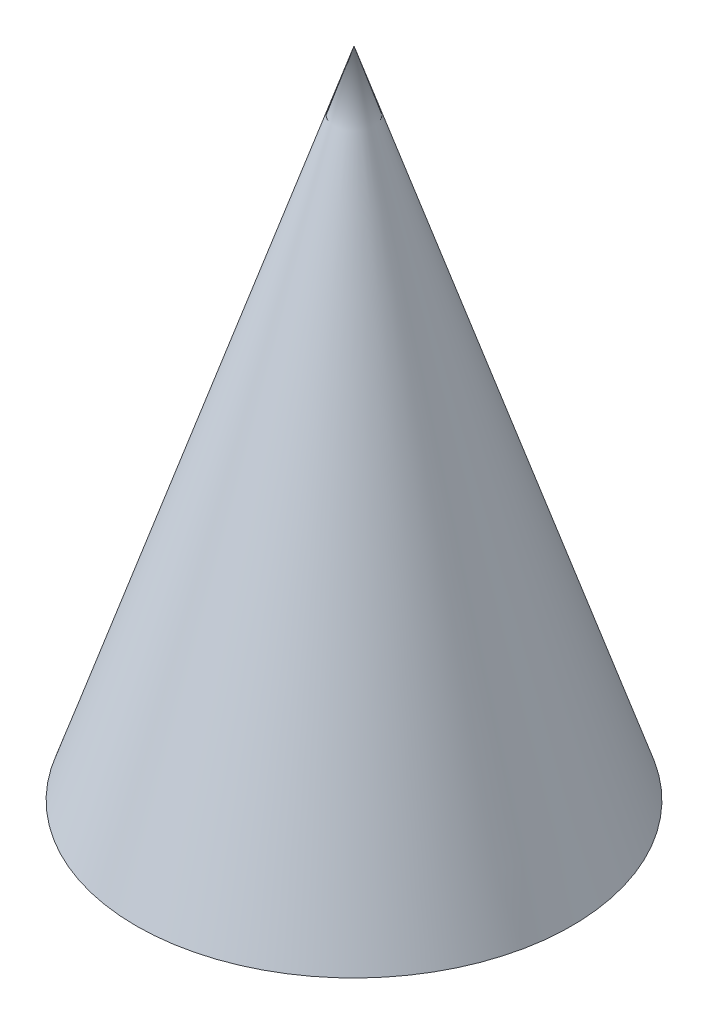
ISO-10303-21;
HEADER;
FILE_DESCRIPTION(('STEP AP214'),'2;1');
FILE_NAME('part.step','',(''),(''),'','','');
FILE_SCHEMA(('AUTOMOTIVE_DESIGN { 1 0 10303 214 1 1 1 1 }'));
ENDSEC;
DATA;
#1=APPLICATION_CONTEXT('core data for automotive mechanical design processes');
#2=APPLICATION_PROTOCOL_DEFINITION('international standard','automotive_design',2000,#1);
#3=PRODUCT_CONTEXT('',#1,'mechanical');
#4=PRODUCT('Part','Part','',(#3));
#5=PRODUCT_RELATED_PRODUCT_CATEGORY('part','',(#4));
#6=PRODUCT_DEFINITION_FORMATION('','',#4);
#7=PRODUCT_DEFINITION_CONTEXT('part definition',#1,'design');
#8=PRODUCT_DEFINITION('design','',#6,#7);
#9=PRODUCT_DEFINITION_SHAPE('','',#8);
#10=(LENGTH_UNIT() NAMED_UNIT(*) SI_UNIT(.MILLI.,.METRE.));
#11=(NAMED_UNIT(*) PLANE_ANGLE_UNIT() SI_UNIT($,.RADIAN.));
#12=(NAMED_UNIT(*) SI_UNIT($,.STERADIAN.) SOLID_ANGLE_UNIT());
#13=UNCERTAINTY_MEASURE_WITH_UNIT(LENGTH_MEASURE(1.E-05),#10,'distance_accuracy_value','');
#14=(GEOMETRIC_REPRESENTATION_CONTEXT(3) GLOBAL_UNCERTAINTY_ASSIGNED_CONTEXT((#13)) GLOBAL_UNIT_ASSIGNED_CONTEXT((#10,
#11,#12)) REPRESENTATION_CONTEXT('',''));
#15=CARTESIAN_POINT('',(0.,0.,0.));
#16=DIRECTION('',(0.,0.,1.));
#17=DIRECTION('',(1.,0.,0.));
#18=AXIS2_PLACEMENT_3D('',#15,#16,#17);
#19=CARTESIAN_POINT('',(0.,0.,0.));
#20=DIRECTION('',(0.,1.,0.));
#21=DIRECTION('',(0.,0.,1.));
#22=AXIS2_PLACEMENT_3D('',#19,#20,#21);
#23=PLANE('',#22);
#24=CARTESIAN_POINT('',(0.,0.,0.));
#25=DIRECTION('',(0.,1.,0.));
#26=DIRECTION('',(0.,0.,1.));
#27=AXIS2_PLACEMENT_3D('',#24,#25,#26);
#28=CIRCLE('',#27,10.);
#29=CARTESIAN_POINT('',(0.,0.,10.));
#30=VERTEX_POINT('',#29);
#31=EDGE_CURVE('E12',#30,#30,#28,.T.);
#32=ORIENTED_EDGE('',*,*,#31,.F.);
#33=EDGE_LOOP('',(#32));
#34=FACE_BOUND('',#33,.T.);
#35=ADVANCED_FACE('F44',(#34),#23,.F.);
#36=CARTESIAN_POINT('',(0.,30.,0.));
#37=DIRECTION('',(0.,-1.,0.));
#38=DIRECTION('',(0.,0.,-1.));
#39=AXIS2_PLACEMENT_3D('',#36,#37,#38);
#40=CONICAL_SURFACE('',#39,0.,0.321750554396642);
#41=ORIENTED_EDGE('',*,*,#31,.T.);
#42=EDGE_LOOP('',(#41));
#43=FACE_BOUND('',#42,.T.);
#44=CARTESIAN_POINT('',(0.,30.,0.));
#45=VERTEX_POINT('',#44);
#46=VERTEX_LOOP('',#45);
#47=FACE_BOUND('',#46,.T.);
#48=ADVANCED_FACE('F46',(#43,#47),#40,.T.);
#49=CLOSED_SHELL('',(#35,#48));
#50=MANIFOLD_SOLID_BREP('B2',#49);
#51=ADVANCED_BREP_SHAPE_REPRESENTATION('',(#18,#50),#14);
#52=SHAPE_DEFINITION_REPRESENTATION(#9,#51);
ENDSEC;
END-ISO-10303-21;
